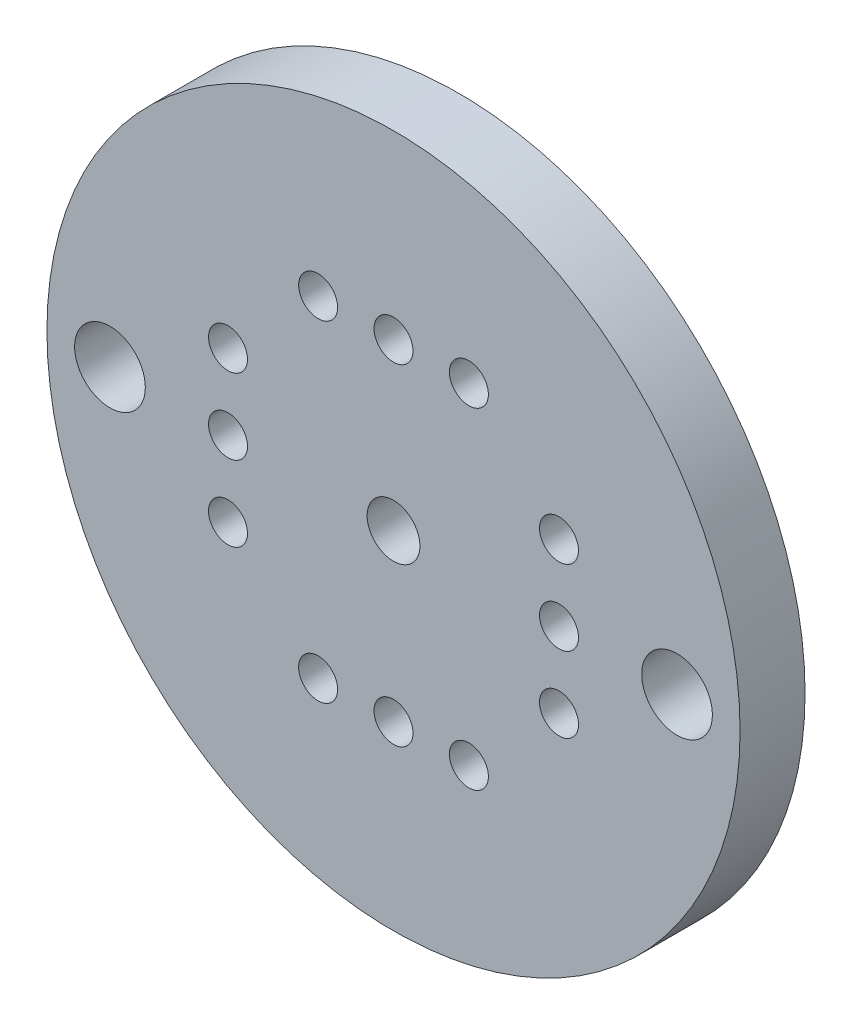
ISO-10303-21;
HEADER;
FILE_DESCRIPTION(('STEP AP214'),'2;1');
FILE_NAME('part.step','',(''),(''),'','','');
FILE_SCHEMA(('AUTOMOTIVE_DESIGN { 1 0 10303 214 1 1 1 1 }'));
ENDSEC;
DATA;
#1=APPLICATION_CONTEXT('core data for automotive mechanical design processes');
#2=APPLICATION_PROTOCOL_DEFINITION('international standard','automotive_design',2000,#1);
#3=PRODUCT_CONTEXT('',#1,'mechanical');
#4=PRODUCT('Part','Part','',(#3));
#5=PRODUCT_RELATED_PRODUCT_CATEGORY('part','',(#4));
#6=PRODUCT_DEFINITION_FORMATION('','',#4);
#7=PRODUCT_DEFINITION_CONTEXT('part definition',#1,'design');
#8=PRODUCT_DEFINITION('design','',#6,#7);
#9=PRODUCT_DEFINITION_SHAPE('','',#8);
#10=(LENGTH_UNIT() NAMED_UNIT(*) SI_UNIT(.MILLI.,.METRE.));
#11=(NAMED_UNIT(*) PLANE_ANGLE_UNIT() SI_UNIT($,.RADIAN.));
#12=(NAMED_UNIT(*) SI_UNIT($,.STERADIAN.) SOLID_ANGLE_UNIT());
#13=UNCERTAINTY_MEASURE_WITH_UNIT(LENGTH_MEASURE(1.E-05),#10,'distance_accuracy_value','');
#14=(GEOMETRIC_REPRESENTATION_CONTEXT(3) GLOBAL_UNCERTAINTY_ASSIGNED_CONTEXT((#13)) GLOBAL_UNIT_ASSIGNED_CONTEXT((#10,
#11,#12)) REPRESENTATION_CONTEXT('',''));
#15=CARTESIAN_POINT('',(0.,0.,0.));
#16=DIRECTION('',(0.,0.,1.));
#17=DIRECTION('',(1.,0.,0.));
#18=AXIS2_PLACEMENT_3D('',#15,#16,#17);
#19=CARTESIAN_POINT('',(0.,0.,3.));
#20=DIRECTION('',(0.,0.,-1.));
#21=DIRECTION('',(-1.,0.,0.));
#22=AXIS2_PLACEMENT_3D('',#19,#20,#21);
#23=CYLINDRICAL_SURFACE('',#22,16.);
#24=CARTESIAN_POINT('',(0.,0.,3.));
#25=DIRECTION('',(0.,0.,1.));
#26=DIRECTION('',(1.,0.,0.));
#27=AXIS2_PLACEMENT_3D('',#24,#25,#26);
#28=CIRCLE('',#27,16.);
#29=CARTESIAN_POINT('',(16.,0.,3.));
#30=VERTEX_POINT('',#29);
#31=EDGE_CURVE('E10',#30,#30,#28,.T.);
#32=ORIENTED_EDGE('',*,*,#31,.F.);
#33=EDGE_LOOP('',(#32));
#34=FACE_BOUND('',#33,.T.);
#35=CARTESIAN_POINT('',(0.,0.,0.));
#36=DIRECTION('',(0.,0.,1.));
#37=DIRECTION('',(1.,0.,0.));
#38=AXIS2_PLACEMENT_3D('',#35,#36,#37);
#39=CIRCLE('',#38,16.);
#40=CARTESIAN_POINT('',(16.,0.,0.));
#41=VERTEX_POINT('',#40);
#42=EDGE_CURVE('E34',#41,#41,#39,.T.);
#43=ORIENTED_EDGE('',*,*,#42,.T.);
#44=EDGE_LOOP('',(#43));
#45=FACE_BOUND('',#44,.T.);
#46=ADVANCED_FACE('F31',(#34,#45),#23,.T.);
#47=CARTESIAN_POINT('',(0.,0.,3.));
#48=DIRECTION('',(0.,0.,1.));
#49=DIRECTION('',(1.,0.,0.));
#50=AXIS2_PLACEMENT_3D('',#47,#48,#49);
#51=PLANE('',#50);
#52=CARTESIAN_POINT('',(0.,0.,3.));
#53=DIRECTION('',(0.,0.,1.));
#54=DIRECTION('',(1.,0.,0.));
#55=AXIS2_PLACEMENT_3D('',#52,#53,#54);
#56=CIRCLE('',#55,1.2192);
#57=CARTESIAN_POINT('',(1.2192,0.,3.));
#58=VERTEX_POINT('',#57);
#59=EDGE_CURVE('E129',#58,#58,#56,.T.);
#60=ORIENTED_EDGE('',*,*,#59,.F.);
#61=EDGE_LOOP('',(#60));
#62=FACE_BOUND('',#61,.T.);
#63=CARTESIAN_POINT('',(-13.09,0.,3.));
#64=DIRECTION('',(0.,0.,1.));
#65=DIRECTION('',(1.,0.,0.));
#66=AXIS2_PLACEMENT_3D('',#63,#64,#65);
#67=CIRCLE('',#66,1.63195);
#68=CARTESIAN_POINT('',(-11.45805,0.,3.));
#69=VERTEX_POINT('',#68);
#70=EDGE_CURVE('E123',#69,#69,#67,.T.);
#71=ORIENTED_EDGE('',*,*,#70,.F.);
#72=EDGE_LOOP('',(#71));
#73=FACE_BOUND('',#72,.T.);
#74=CARTESIAN_POINT('',(13.09,0.,3.));
#75=DIRECTION('',(0.,0.,1.));
#76=DIRECTION('',(1.,0.,0.));
#77=AXIS2_PLACEMENT_3D('',#74,#75,#76);
#78=CIRCLE('',#77,1.63195);
#79=CARTESIAN_POINT('',(14.72195,0.,3.));
#80=VERTEX_POINT('',#79);
#81=EDGE_CURVE('E117',#80,#80,#78,.T.);
#82=ORIENTED_EDGE('',*,*,#81,.F.);
#83=EDGE_LOOP('',(#82));
#84=FACE_BOUND('',#83,.T.);
#85=CARTESIAN_POINT('',(-3.48,7.64,3.));
#86=DIRECTION('',(0.,0.,1.));
#87=DIRECTION('',(1.,0.,0.));
#88=AXIS2_PLACEMENT_3D('',#85,#86,#87);
#89=CIRCLE('',#88,0.9);
#90=CARTESIAN_POINT('',(-2.58,7.64,3.));
#91=VERTEX_POINT('',#90);
#92=EDGE_CURVE('E111',#91,#91,#89,.T.);
#93=ORIENTED_EDGE('',*,*,#92,.F.);
#94=EDGE_LOOP('',(#93));
#95=FACE_BOUND('',#94,.T.);
#96=CARTESIAN_POINT('',(0.,7.64,3.));
#97=DIRECTION('',(0.,0.,1.));
#98=DIRECTION('',(1.,0.,0.));
#99=AXIS2_PLACEMENT_3D('',#96,#97,#98);
#100=CIRCLE('',#99,0.9);
#101=CARTESIAN_POINT('',(0.9,7.64,3.));
#102=VERTEX_POINT('',#101);
#103=EDGE_CURVE('E105',#102,#102,#100,.T.);
#104=ORIENTED_EDGE('',*,*,#103,.F.);
#105=EDGE_LOOP('',(#104));
#106=FACE_BOUND('',#105,.T.);
#107=CARTESIAN_POINT('',(3.48,7.64,3.));
#108=DIRECTION('',(0.,0.,1.));
#109=DIRECTION('',(1.,0.,0.));
#110=AXIS2_PLACEMENT_3D('',#107,#108,#109);
#111=CIRCLE('',#110,0.9);
#112=CARTESIAN_POINT('',(4.38,7.64,3.));
#113=VERTEX_POINT('',#112);
#114=EDGE_CURVE('E99',#113,#113,#111,.T.);
#115=ORIENTED_EDGE('',*,*,#114,.F.);
#116=EDGE_LOOP('',(#115));
#117=FACE_BOUND('',#116,.T.);
#118=CARTESIAN_POINT('',(7.64,3.48,3.));
#119=DIRECTION('',(0.,0.,1.));
#120=DIRECTION('',(1.,0.,0.));
#121=AXIS2_PLACEMENT_3D('',#118,#119,#120);
#122=CIRCLE('',#121,0.9);
#123=CARTESIAN_POINT('',(8.54,3.48,3.));
#124=VERTEX_POINT('',#123);
#125=EDGE_CURVE('E93',#124,#124,#122,.T.);
#126=ORIENTED_EDGE('',*,*,#125,.F.);
#127=EDGE_LOOP('',(#126));
#128=FACE_BOUND('',#127,.T.);
#129=CARTESIAN_POINT('',(7.64,-3.48,3.));
#130=DIRECTION('',(0.,0.,1.));
#131=DIRECTION('',(1.,0.,0.));
#132=AXIS2_PLACEMENT_3D('',#129,#130,#131);
#133=CIRCLE('',#132,0.9);
#134=CARTESIAN_POINT('',(8.54,-3.48,3.));
#135=VERTEX_POINT('',#134);
#136=EDGE_CURVE('E87',#135,#135,#133,.T.);
#137=ORIENTED_EDGE('',*,*,#136,.F.);
#138=EDGE_LOOP('',(#137));
#139=FACE_BOUND('',#138,.T.);
#140=CARTESIAN_POINT('',(7.64,0.,3.));
#141=DIRECTION('',(0.,0.,1.));
#142=DIRECTION('',(1.,0.,0.));
#143=AXIS2_PLACEMENT_3D('',#140,#141,#142);
#144=CIRCLE('',#143,0.9);
#145=CARTESIAN_POINT('',(8.54,0.,3.));
#146=VERTEX_POINT('',#145);
#147=EDGE_CURVE('E81',#146,#146,#144,.T.);
#148=ORIENTED_EDGE('',*,*,#147,.F.);
#149=EDGE_LOOP('',(#148));
#150=FACE_BOUND('',#149,.T.);
#151=CARTESIAN_POINT('',(3.48,-7.64,3.));
#152=DIRECTION('',(0.,0.,1.));
#153=DIRECTION('',(1.,0.,0.));
#154=AXIS2_PLACEMENT_3D('',#151,#152,#153);
#155=CIRCLE('',#154,0.9);
#156=CARTESIAN_POINT('',(4.38,-7.64,3.));
#157=VERTEX_POINT('',#156);
#158=EDGE_CURVE('E75',#157,#157,#155,.T.);
#159=ORIENTED_EDGE('',*,*,#158,.F.);
#160=EDGE_LOOP('',(#159));
#161=FACE_BOUND('',#160,.T.);
#162=CARTESIAN_POINT('',(0.,-7.64,3.));
#163=DIRECTION('',(0.,0.,1.));
#164=DIRECTION('',(1.,0.,0.));
#165=AXIS2_PLACEMENT_3D('',#162,#163,#164);
#166=CIRCLE('',#165,0.9);
#167=CARTESIAN_POINT('',(0.9,-7.64,3.));
#168=VERTEX_POINT('',#167);
#169=EDGE_CURVE('E69',#168,#168,#166,.T.);
#170=ORIENTED_EDGE('',*,*,#169,.F.);
#171=EDGE_LOOP('',(#170));
#172=FACE_BOUND('',#171,.T.);
#173=CARTESIAN_POINT('',(-3.48,-7.64,3.));
#174=DIRECTION('',(0.,0.,1.));
#175=DIRECTION('',(1.,0.,0.));
#176=AXIS2_PLACEMENT_3D('',#173,#174,#175);
#177=CIRCLE('',#176,0.9);
#178=CARTESIAN_POINT('',(-2.58,-7.64,3.));
#179=VERTEX_POINT('',#178);
#180=EDGE_CURVE('E63',#179,#179,#177,.T.);
#181=ORIENTED_EDGE('',*,*,#180,.F.);
#182=EDGE_LOOP('',(#181));
#183=FACE_BOUND('',#182,.T.);
#184=CARTESIAN_POINT('',(-7.64,0.,3.));
#185=DIRECTION('',(0.,0.,1.));
#186=DIRECTION('',(1.,0.,0.));
#187=AXIS2_PLACEMENT_3D('',#184,#185,#186);
#188=CIRCLE('',#187,0.9);
#189=CARTESIAN_POINT('',(-6.74,0.,3.));
#190=VERTEX_POINT('',#189);
#191=EDGE_CURVE('E57',#190,#190,#188,.T.);
#192=ORIENTED_EDGE('',*,*,#191,.F.);
#193=EDGE_LOOP('',(#192));
#194=FACE_BOUND('',#193,.T.);
#195=CARTESIAN_POINT('',(-7.64,-3.48,3.));
#196=DIRECTION('',(0.,0.,1.));
#197=DIRECTION('',(1.,0.,0.));
#198=AXIS2_PLACEMENT_3D('',#195,#196,#197);
#199=CIRCLE('',#198,0.9);
#200=CARTESIAN_POINT('',(-6.74,-3.48,3.));
#201=VERTEX_POINT('',#200);
#202=EDGE_CURVE('E51',#201,#201,#199,.T.);
#203=ORIENTED_EDGE('',*,*,#202,.F.);
#204=EDGE_LOOP('',(#203));
#205=FACE_BOUND('',#204,.T.);
#206=CARTESIAN_POINT('',(-7.64,3.48,3.));
#207=DIRECTION('',(0.,0.,1.));
#208=DIRECTION('',(1.,0.,0.));
#209=AXIS2_PLACEMENT_3D('',#206,#207,#208);
#210=CIRCLE('',#209,0.9);
#211=CARTESIAN_POINT('',(-6.74,3.48,3.));
#212=VERTEX_POINT('',#211);
#213=EDGE_CURVE('E45',#212,#212,#210,.T.);
#214=ORIENTED_EDGE('',*,*,#213,.F.);
#215=EDGE_LOOP('',(#214));
#216=FACE_BOUND('',#215,.T.);
#217=ORIENTED_EDGE('',*,*,#31,.T.);
#218=EDGE_LOOP('',(#217));
#219=FACE_BOUND('',#218,.T.);
#220=ADVANCED_FACE('F135',(#62,#73,#84,#95,#106,#117,#128,#139,#150,#161,#172,#183,#194,#205,
#216,#219),#51,.T.);
#221=CARTESIAN_POINT('',(0.,0.,0.));
#222=DIRECTION('',(0.,0.,1.));
#223=DIRECTION('',(1.,0.,0.));
#224=AXIS2_PLACEMENT_3D('',#221,#222,#223);
#225=PLANE('',#224);
#226=CARTESIAN_POINT('',(0.,0.,0.));
#227=DIRECTION('',(0.,0.,1.));
#228=DIRECTION('',(1.,0.,0.));
#229=AXIS2_PLACEMENT_3D('',#226,#227,#228);
#230=CIRCLE('',#229,1.2192);
#231=CARTESIAN_POINT('',(1.2192,0.,0.));
#232=VERTEX_POINT('',#231);
#233=EDGE_CURVE('E126',#232,#232,#230,.T.);
#234=ORIENTED_EDGE('',*,*,#233,.T.);
#235=EDGE_LOOP('',(#234));
#236=FACE_BOUND('',#235,.T.);
#237=CARTESIAN_POINT('',(-13.09,0.,0.));
#238=DIRECTION('',(0.,0.,1.));
#239=DIRECTION('',(1.,0.,0.));
#240=AXIS2_PLACEMENT_3D('',#237,#238,#239);
#241=CIRCLE('',#240,1.63195);
#242=CARTESIAN_POINT('',(-11.45805,0.,0.));
#243=VERTEX_POINT('',#242);
#244=EDGE_CURVE('E120',#243,#243,#241,.T.);
#245=ORIENTED_EDGE('',*,*,#244,.T.);
#246=EDGE_LOOP('',(#245));
#247=FACE_BOUND('',#246,.T.);
#248=CARTESIAN_POINT('',(13.09,0.,0.));
#249=DIRECTION('',(0.,0.,1.));
#250=DIRECTION('',(1.,0.,0.));
#251=AXIS2_PLACEMENT_3D('',#248,#249,#250);
#252=CIRCLE('',#251,1.63195);
#253=CARTESIAN_POINT('',(14.72195,0.,0.));
#254=VERTEX_POINT('',#253);
#255=EDGE_CURVE('E114',#254,#254,#252,.T.);
#256=ORIENTED_EDGE('',*,*,#255,.T.);
#257=EDGE_LOOP('',(#256));
#258=FACE_BOUND('',#257,.T.);
#259=CARTESIAN_POINT('',(-3.48,7.64,0.));
#260=DIRECTION('',(0.,0.,1.));
#261=DIRECTION('',(1.,0.,0.));
#262=AXIS2_PLACEMENT_3D('',#259,#260,#261);
#263=CIRCLE('',#262,0.9);
#264=CARTESIAN_POINT('',(-2.58,7.64,0.));
#265=VERTEX_POINT('',#264);
#266=EDGE_CURVE('E108',#265,#265,#263,.T.);
#267=ORIENTED_EDGE('',*,*,#266,.T.);
#268=EDGE_LOOP('',(#267));
#269=FACE_BOUND('',#268,.T.);
#270=CARTESIAN_POINT('',(0.,7.64,0.));
#271=DIRECTION('',(0.,0.,1.));
#272=DIRECTION('',(1.,0.,0.));
#273=AXIS2_PLACEMENT_3D('',#270,#271,#272);
#274=CIRCLE('',#273,0.9);
#275=CARTESIAN_POINT('',(0.9,7.64,0.));
#276=VERTEX_POINT('',#275);
#277=EDGE_CURVE('E102',#276,#276,#274,.T.);
#278=ORIENTED_EDGE('',*,*,#277,.T.);
#279=EDGE_LOOP('',(#278));
#280=FACE_BOUND('',#279,.T.);
#281=CARTESIAN_POINT('',(3.48,7.64,0.));
#282=DIRECTION('',(0.,0.,1.));
#283=DIRECTION('',(1.,0.,0.));
#284=AXIS2_PLACEMENT_3D('',#281,#282,#283);
#285=CIRCLE('',#284,0.899999999999999);
#286=CARTESIAN_POINT('',(4.38,7.64,0.));
#287=VERTEX_POINT('',#286);
#288=EDGE_CURVE('E96',#287,#287,#285,.T.);
#289=ORIENTED_EDGE('',*,*,#288,.T.);
#290=EDGE_LOOP('',(#289));
#291=FACE_BOUND('',#290,.T.);
#292=CARTESIAN_POINT('',(7.64,3.48,0.));
#293=DIRECTION('',(0.,0.,1.));
#294=DIRECTION('',(1.,0.,0.));
#295=AXIS2_PLACEMENT_3D('',#292,#293,#294);
#296=CIRCLE('',#295,0.9);
#297=CARTESIAN_POINT('',(8.54,3.48,0.));
#298=VERTEX_POINT('',#297);
#299=EDGE_CURVE('E90',#298,#298,#296,.T.);
#300=ORIENTED_EDGE('',*,*,#299,.T.);
#301=EDGE_LOOP('',(#300));
#302=FACE_BOUND('',#301,.T.);
#303=CARTESIAN_POINT('',(7.64,-3.48,0.));
#304=DIRECTION('',(0.,0.,1.));
#305=DIRECTION('',(1.,0.,0.));
#306=AXIS2_PLACEMENT_3D('',#303,#304,#305);
#307=CIRCLE('',#306,0.9);
#308=CARTESIAN_POINT('',(8.54,-3.48,0.));
#309=VERTEX_POINT('',#308);
#310=EDGE_CURVE('E84',#309,#309,#307,.T.);
#311=ORIENTED_EDGE('',*,*,#310,.T.);
#312=EDGE_LOOP('',(#311));
#313=FACE_BOUND('',#312,.T.);
#314=CARTESIAN_POINT('',(7.64,0.,0.));
#315=DIRECTION('',(0.,0.,1.));
#316=DIRECTION('',(1.,0.,0.));
#317=AXIS2_PLACEMENT_3D('',#314,#315,#316);
#318=CIRCLE('',#317,0.9);
#319=CARTESIAN_POINT('',(8.54,0.,0.));
#320=VERTEX_POINT('',#319);
#321=EDGE_CURVE('E78',#320,#320,#318,.T.);
#322=ORIENTED_EDGE('',*,*,#321,.T.);
#323=EDGE_LOOP('',(#322));
#324=FACE_BOUND('',#323,.T.);
#325=CARTESIAN_POINT('',(3.48,-7.64,0.));
#326=DIRECTION('',(0.,0.,1.));
#327=DIRECTION('',(1.,0.,0.));
#328=AXIS2_PLACEMENT_3D('',#325,#326,#327);
#329=CIRCLE('',#328,0.9);
#330=CARTESIAN_POINT('',(4.38,-7.64,0.));
#331=VERTEX_POINT('',#330);
#332=EDGE_CURVE('E72',#331,#331,#329,.T.);
#333=ORIENTED_EDGE('',*,*,#332,.T.);
#334=EDGE_LOOP('',(#333));
#335=FACE_BOUND('',#334,.T.);
#336=CARTESIAN_POINT('',(0.,-7.64,0.));
#337=DIRECTION('',(0.,0.,1.));
#338=DIRECTION('',(1.,0.,0.));
#339=AXIS2_PLACEMENT_3D('',#336,#337,#338);
#340=CIRCLE('',#339,0.9);
#341=CARTESIAN_POINT('',(0.9,-7.64,0.));
#342=VERTEX_POINT('',#341);
#343=EDGE_CURVE('E66',#342,#342,#340,.T.);
#344=ORIENTED_EDGE('',*,*,#343,.T.);
#345=EDGE_LOOP('',(#344));
#346=FACE_BOUND('',#345,.T.);
#347=CARTESIAN_POINT('',(-3.48,-7.64,0.));
#348=DIRECTION('',(0.,0.,1.));
#349=DIRECTION('',(1.,0.,0.));
#350=AXIS2_PLACEMENT_3D('',#347,#348,#349);
#351=CIRCLE('',#350,0.9);
#352=CARTESIAN_POINT('',(-2.58,-7.64,0.));
#353=VERTEX_POINT('',#352);
#354=EDGE_CURVE('E60',#353,#353,#351,.T.);
#355=ORIENTED_EDGE('',*,*,#354,.T.);
#356=EDGE_LOOP('',(#355));
#357=FACE_BOUND('',#356,.T.);
#358=CARTESIAN_POINT('',(-7.64,0.,0.));
#359=DIRECTION('',(0.,0.,1.));
#360=DIRECTION('',(1.,0.,0.));
#361=AXIS2_PLACEMENT_3D('',#358,#359,#360);
#362=CIRCLE('',#361,0.9);
#363=CARTESIAN_POINT('',(-6.74,0.,0.));
#364=VERTEX_POINT('',#363);
#365=EDGE_CURVE('E54',#364,#364,#362,.T.);
#366=ORIENTED_EDGE('',*,*,#365,.T.);
#367=EDGE_LOOP('',(#366));
#368=FACE_BOUND('',#367,.T.);
#369=CARTESIAN_POINT('',(-7.64,-3.48,0.));
#370=DIRECTION('',(0.,0.,1.));
#371=DIRECTION('',(1.,0.,0.));
#372=AXIS2_PLACEMENT_3D('',#369,#370,#371);
#373=CIRCLE('',#372,0.9);
#374=CARTESIAN_POINT('',(-6.74,-3.48,0.));
#375=VERTEX_POINT('',#374);
#376=EDGE_CURVE('E48',#375,#375,#373,.T.);
#377=ORIENTED_EDGE('',*,*,#376,.T.);
#378=EDGE_LOOP('',(#377));
#379=FACE_BOUND('',#378,.T.);
#380=CARTESIAN_POINT('',(-7.64,3.48,0.));
#381=DIRECTION('',(0.,0.,1.));
#382=DIRECTION('',(1.,0.,0.));
#383=AXIS2_PLACEMENT_3D('',#380,#381,#382);
#384=CIRCLE('',#383,0.9);
#385=CARTESIAN_POINT('',(-6.74,3.48,0.));
#386=VERTEX_POINT('',#385);
#387=EDGE_CURVE('E41',#386,#386,#384,.T.);
#388=ORIENTED_EDGE('',*,*,#387,.T.);
#389=EDGE_LOOP('',(#388));
#390=FACE_BOUND('',#389,.T.);
#391=ORIENTED_EDGE('',*,*,#42,.F.);
#392=EDGE_LOOP('',(#391));
#393=FACE_BOUND('',#392,.T.);
#394=ADVANCED_FACE('F138',(#236,#247,#258,#269,#280,#291,#302,#313,#324,#335,#346,#357,#368,
#379,#390,#393),#225,.F.);
#395=CARTESIAN_POINT('',(-7.64,3.48,3.));
#396=DIRECTION('',(0.,0.,1.));
#397=DIRECTION('',(1.,0.,0.));
#398=AXIS2_PLACEMENT_3D('',#395,#396,#397);
#399=CYLINDRICAL_SURFACE('',#398,0.9);
#400=ORIENTED_EDGE('',*,*,#387,.F.);
#401=EDGE_LOOP('',(#400));
#402=FACE_BOUND('',#401,.T.);
#403=ORIENTED_EDGE('',*,*,#213,.T.);
#404=EDGE_LOOP('',(#403));
#405=FACE_BOUND('',#404,.T.);
#406=ADVANCED_FACE('F168',(#402,#405),#399,.F.);
#407=CARTESIAN_POINT('',(-7.64,-3.48,3.));
#408=DIRECTION('',(0.,0.,1.));
#409=DIRECTION('',(1.,0.,0.));
#410=AXIS2_PLACEMENT_3D('',#407,#408,#409);
#411=CYLINDRICAL_SURFACE('',#410,0.9);
#412=ORIENTED_EDGE('',*,*,#376,.F.);
#413=EDGE_LOOP('',(#412));
#414=FACE_BOUND('',#413,.T.);
#415=ORIENTED_EDGE('',*,*,#202,.T.);
#416=EDGE_LOOP('',(#415));
#417=FACE_BOUND('',#416,.T.);
#418=ADVANCED_FACE('F170',(#414,#417),#411,.F.);
#419=CARTESIAN_POINT('',(-7.64,0.,3.));
#420=DIRECTION('',(0.,0.,1.));
#421=DIRECTION('',(1.,0.,0.));
#422=AXIS2_PLACEMENT_3D('',#419,#420,#421);
#423=CYLINDRICAL_SURFACE('',#422,0.9);
#424=ORIENTED_EDGE('',*,*,#365,.F.);
#425=EDGE_LOOP('',(#424));
#426=FACE_BOUND('',#425,.T.);
#427=ORIENTED_EDGE('',*,*,#191,.T.);
#428=EDGE_LOOP('',(#427));
#429=FACE_BOUND('',#428,.T.);
#430=ADVANCED_FACE('F177',(#426,#429),#423,.F.);
#431=CARTESIAN_POINT('',(-3.48,-7.64,3.));
#432=DIRECTION('',(0.,0.,1.));
#433=DIRECTION('',(1.,0.,0.));
#434=AXIS2_PLACEMENT_3D('',#431,#432,#433);
#435=CYLINDRICAL_SURFACE('',#434,0.9);
#436=ORIENTED_EDGE('',*,*,#354,.F.);
#437=EDGE_LOOP('',(#436));
#438=FACE_BOUND('',#437,.T.);
#439=ORIENTED_EDGE('',*,*,#180,.T.);
#440=EDGE_LOOP('',(#439));
#441=FACE_BOUND('',#440,.T.);
#442=ADVANCED_FACE('F288',(#438,#441),#435,.F.);
#443=CARTESIAN_POINT('',(0.,-7.64,3.));
#444=DIRECTION('',(0.,0.,1.));
#445=DIRECTION('',(1.,0.,0.));
#446=AXIS2_PLACEMENT_3D('',#443,#444,#445);
#447=CYLINDRICAL_SURFACE('',#446,0.9);
#448=ORIENTED_EDGE('',*,*,#343,.F.);
#449=EDGE_LOOP('',(#448));
#450=FACE_BOUND('',#449,.T.);
#451=ORIENTED_EDGE('',*,*,#169,.T.);
#452=EDGE_LOOP('',(#451));
#453=FACE_BOUND('',#452,.T.);
#454=ADVANCED_FACE('F280',(#450,#453),#447,.F.);
#455=CARTESIAN_POINT('',(3.48,-7.64,3.));
#456=DIRECTION('',(0.,0.,1.));
#457=DIRECTION('',(1.,0.,0.));
#458=AXIS2_PLACEMENT_3D('',#455,#456,#457);
#459=CYLINDRICAL_SURFACE('',#458,0.9);
#460=ORIENTED_EDGE('',*,*,#332,.F.);
#461=EDGE_LOOP('',(#460));
#462=FACE_BOUND('',#461,.T.);
#463=ORIENTED_EDGE('',*,*,#158,.T.);
#464=EDGE_LOOP('',(#463));
#465=FACE_BOUND('',#464,.T.);
#466=ADVANCED_FACE('F272',(#462,#465),#459,.F.);
#467=CARTESIAN_POINT('',(7.64,0.,3.));
#468=DIRECTION('',(0.,0.,1.));
#469=DIRECTION('',(1.,0.,0.));
#470=AXIS2_PLACEMENT_3D('',#467,#468,#469);
#471=CYLINDRICAL_SURFACE('',#470,0.9);
#472=ORIENTED_EDGE('',*,*,#321,.F.);
#473=EDGE_LOOP('',(#472));
#474=FACE_BOUND('',#473,.T.);
#475=ORIENTED_EDGE('',*,*,#147,.T.);
#476=EDGE_LOOP('',(#475));
#477=FACE_BOUND('',#476,.T.);
#478=ADVANCED_FACE('F264',(#474,#477),#471,.F.);
#479=CARTESIAN_POINT('',(7.64,-3.48,3.));
#480=DIRECTION('',(0.,0.,1.));
#481=DIRECTION('',(1.,0.,0.));
#482=AXIS2_PLACEMENT_3D('',#479,#480,#481);
#483=CYLINDRICAL_SURFACE('',#482,0.9);
#484=ORIENTED_EDGE('',*,*,#310,.F.);
#485=EDGE_LOOP('',(#484));
#486=FACE_BOUND('',#485,.T.);
#487=ORIENTED_EDGE('',*,*,#136,.T.);
#488=EDGE_LOOP('',(#487));
#489=FACE_BOUND('',#488,.T.);
#490=ADVANCED_FACE('F256',(#486,#489),#483,.F.);
#491=CARTESIAN_POINT('',(7.64,3.48,3.));
#492=DIRECTION('',(0.,0.,1.));
#493=DIRECTION('',(1.,0.,0.));
#494=AXIS2_PLACEMENT_3D('',#491,#492,#493);
#495=CYLINDRICAL_SURFACE('',#494,0.9);
#496=ORIENTED_EDGE('',*,*,#299,.F.);
#497=EDGE_LOOP('',(#496));
#498=FACE_BOUND('',#497,.T.);
#499=ORIENTED_EDGE('',*,*,#125,.T.);
#500=EDGE_LOOP('',(#499));
#501=FACE_BOUND('',#500,.T.);
#502=ADVANCED_FACE('F248',(#498,#501),#495,.F.);
#503=CARTESIAN_POINT('',(3.48,7.64,3.));
#504=DIRECTION('',(0.,0.,1.));
#505=DIRECTION('',(1.,0.,0.));
#506=AXIS2_PLACEMENT_3D('',#503,#504,#505);
#507=CYLINDRICAL_SURFACE('',#506,0.9);
#508=ORIENTED_EDGE('',*,*,#288,.F.);
#509=EDGE_LOOP('',(#508));
#510=FACE_BOUND('',#509,.T.);
#511=ORIENTED_EDGE('',*,*,#114,.T.);
#512=EDGE_LOOP('',(#511));
#513=FACE_BOUND('',#512,.T.);
#514=ADVANCED_FACE('F240',(#510,#513),#507,.F.);
#515=CARTESIAN_POINT('',(0.,7.64,3.));
#516=DIRECTION('',(0.,0.,1.));
#517=DIRECTION('',(1.,0.,0.));
#518=AXIS2_PLACEMENT_3D('',#515,#516,#517);
#519=CYLINDRICAL_SURFACE('',#518,0.9);
#520=ORIENTED_EDGE('',*,*,#277,.F.);
#521=EDGE_LOOP('',(#520));
#522=FACE_BOUND('',#521,.T.);
#523=ORIENTED_EDGE('',*,*,#103,.T.);
#524=EDGE_LOOP('',(#523));
#525=FACE_BOUND('',#524,.T.);
#526=ADVANCED_FACE('F232',(#522,#525),#519,.F.);
#527=CARTESIAN_POINT('',(-3.48,7.64,3.));
#528=DIRECTION('',(0.,0.,1.));
#529=DIRECTION('',(1.,0.,0.));
#530=AXIS2_PLACEMENT_3D('',#527,#528,#529);
#531=CYLINDRICAL_SURFACE('',#530,0.9);
#532=ORIENTED_EDGE('',*,*,#266,.F.);
#533=EDGE_LOOP('',(#532));
#534=FACE_BOUND('',#533,.T.);
#535=ORIENTED_EDGE('',*,*,#92,.T.);
#536=EDGE_LOOP('',(#535));
#537=FACE_BOUND('',#536,.T.);
#538=ADVANCED_FACE('F224',(#534,#537),#531,.F.);
#539=CARTESIAN_POINT('',(13.09,0.,3.));
#540=DIRECTION('',(0.,0.,1.));
#541=DIRECTION('',(1.,0.,0.));
#542=AXIS2_PLACEMENT_3D('',#539,#540,#541);
#543=CYLINDRICAL_SURFACE('',#542,1.63195);
#544=ORIENTED_EDGE('',*,*,#255,.F.);
#545=EDGE_LOOP('',(#544));
#546=FACE_BOUND('',#545,.T.);
#547=ORIENTED_EDGE('',*,*,#81,.T.);
#548=EDGE_LOOP('',(#547));
#549=FACE_BOUND('',#548,.T.);
#550=ADVANCED_FACE('F217',(#546,#549),#543,.F.);
#551=CARTESIAN_POINT('',(-13.09,0.,3.));
#552=DIRECTION('',(0.,0.,1.));
#553=DIRECTION('',(1.,0.,0.));
#554=AXIS2_PLACEMENT_3D('',#551,#552,#553);
#555=CYLINDRICAL_SURFACE('',#554,1.63195);
#556=ORIENTED_EDGE('',*,*,#244,.F.);
#557=EDGE_LOOP('',(#556));
#558=FACE_BOUND('',#557,.T.);
#559=ORIENTED_EDGE('',*,*,#70,.T.);
#560=EDGE_LOOP('',(#559));
#561=FACE_BOUND('',#560,.T.);
#562=ADVANCED_FACE('F207',(#558,#561),#555,.F.);
#563=CARTESIAN_POINT('',(0.,0.,3.));
#564=DIRECTION('',(0.,0.,1.));
#565=DIRECTION('',(1.,0.,0.));
#566=AXIS2_PLACEMENT_3D('',#563,#564,#565);
#567=CYLINDRICAL_SURFACE('',#566,1.2192);
#568=ORIENTED_EDGE('',*,*,#233,.F.);
#569=EDGE_LOOP('',(#568));
#570=FACE_BOUND('',#569,.T.);
#571=ORIENTED_EDGE('',*,*,#59,.T.);
#572=EDGE_LOOP('',(#571));
#573=FACE_BOUND('',#572,.T.);
#574=ADVANCED_FACE('F133',(#570,#573),#567,.F.);
#575=CLOSED_SHELL('',(#46,#220,#394,#406,#418,#430,#442,#454,#466,#478,#490,#502,#514,#526,#538,
#550,#562,#574));
#576=MANIFOLD_SOLID_BREP('B2',#575);
#577=ADVANCED_BREP_SHAPE_REPRESENTATION('',(#18,#576),#14);
#578=SHAPE_DEFINITION_REPRESENTATION(#9,#577);
ENDSEC;
END-ISO-10303-21;
